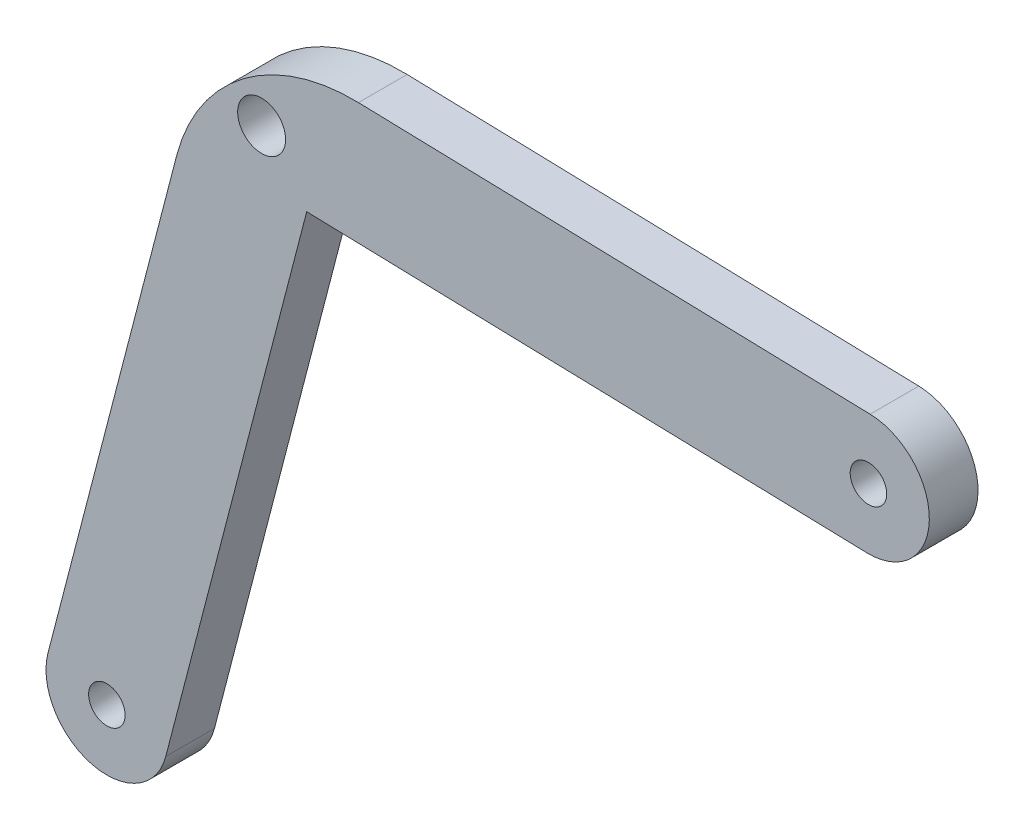
ISO-10303-21;
HEADER;
FILE_DESCRIPTION(('STEP AP214'),'2;1');
FILE_NAME('part.step','',(''),(''),'','','');
FILE_SCHEMA(('AUTOMOTIVE_DESIGN { 1 0 10303 214 1 1 1 1 }'));
ENDSEC;
DATA;
#1=APPLICATION_CONTEXT('core data for automotive mechanical design processes');
#2=APPLICATION_PROTOCOL_DEFINITION('international standard','automotive_design',2000,#1);
#3=PRODUCT_CONTEXT('',#1,'mechanical');
#4=PRODUCT('Part','Part','',(#3));
#5=PRODUCT_RELATED_PRODUCT_CATEGORY('part','',(#4));
#6=PRODUCT_DEFINITION_FORMATION('','',#4);
#7=PRODUCT_DEFINITION_CONTEXT('part definition',#1,'design');
#8=PRODUCT_DEFINITION('design','',#6,#7);
#9=PRODUCT_DEFINITION_SHAPE('','',#8);
#10=(LENGTH_UNIT() NAMED_UNIT(*) SI_UNIT(.MILLI.,.METRE.));
#11=(NAMED_UNIT(*) PLANE_ANGLE_UNIT() SI_UNIT($,.RADIAN.));
#12=(NAMED_UNIT(*) SI_UNIT($,.STERADIAN.) SOLID_ANGLE_UNIT());
#13=UNCERTAINTY_MEASURE_WITH_UNIT(LENGTH_MEASURE(1.E-05),#10,'distance_accuracy_value','');
#14=(GEOMETRIC_REPRESENTATION_CONTEXT(3) GLOBAL_UNCERTAINTY_ASSIGNED_CONTEXT((#13)) GLOBAL_UNIT_ASSIGNED_CONTEXT((#10,
#11,#12)) REPRESENTATION_CONTEXT('',''));
#15=CARTESIAN_POINT('',(0.,0.,0.));
#16=DIRECTION('',(0.,0.,1.));
#17=DIRECTION('',(1.,0.,0.));
#18=AXIS2_PLACEMENT_3D('',#15,#16,#17);
#19=CARTESIAN_POINT('',(55.3800124205492,12.4797142030758,4.));
#20=DIRECTION('',(0.,0.,1.));
#21=DIRECTION('',(1.,0.,0.));
#22=AXIS2_PLACEMENT_3D('',#19,#20,#21);
#23=PLANE('',#22);
#24=CARTESIAN_POINT('',(-7.17896809996962,-34.5429317024096,4.));
#25=DIRECTION('',(0.,0.,1.));
#26=DIRECTION('',(1.,0.,0.));
#27=AXIS2_PLACEMENT_3D('',#24,#25,#26);
#28=CIRCLE('',#27,1.5);
#29=CARTESIAN_POINT('',(-5.67896809996962,-34.5429317024096,4.));
#30=VERTEX_POINT('',#29);
#31=EDGE_CURVE('E155',#30,#30,#28,.T.);
#32=ORIENTED_EDGE('',*,*,#31,.F.);
#33=EDGE_LOOP('',(#32));
#34=FACE_BOUND('',#33,.T.);
#35=DIRECTION('',(-0.999624819704954,0.0273901411065842,0.));
#36=VECTOR('',#35,1.);
#37=CARTESIAN_POINT('',(55.5169631260821,17.4778383016006,4.));
#38=LINE('',#37,#36);
#39=CARTESIAN_POINT('',(55.5169631260821,17.4778383016006,4.));
#40=VERTEX_POINT('',#39);
#41=CARTESIAN_POINT('',(13.4870969886936,18.6294743369421,4.));
#42=VERTEX_POINT('',#41);
#43=EDGE_CURVE('E95',#40,#42,#38,.T.);
#44=ORIENTED_EDGE('',*,*,#43,.T.);
#45=CARTESIAN_POINT('',(13.0762448720949,3.63510204136775,4.));
#46=DIRECTION('',(0.,0.,1.));
#47=DIRECTION('',(1.,0.,0.));
#48=AXIS2_PLACEMENT_3D('',#45,#46,#47);
#49=CIRCLE('',#48,15.);
#50=CARTESIAN_POINT('',(-1.44140101614952,7.40842390194908,4.));
#51=VERTEX_POINT('',#50);
#52=EDGE_CURVE('E11',#42,#51,#49,.T.);
#53=ORIENTED_EDGE('',*,*,#52,.T.);
#54=DIRECTION('',(-0.251554790705422,-0.967843059216292,0.));
#55=VECTOR('',#54,1.);
#56=CARTESIAN_POINT('',(1.56003471690475,18.9562808669237,4.));
#57=LINE('',#56,#55);
#58=CARTESIAN_POINT('',(-12.0181833960511,-33.2851577488824,4.));
#59=VERTEX_POINT('',#58);
#60=EDGE_CURVE('E103',#51,#59,#57,.T.);
#61=ORIENTED_EDGE('',*,*,#60,.T.);
#62=CARTESIAN_POINT('',(-7.17896809996962,-34.5429317024096,4.));
#63=DIRECTION('',(0.,0.,1.));
#64=DIRECTION('',(-1.,0.,0.));
#65=AXIS2_PLACEMENT_3D('',#62,#63,#64);
#66=CIRCLE('',#65,5.);
#67=CARTESIAN_POINT('',(-2.33975280388816,-35.8007056559367,4.));
#68=VERTEX_POINT('',#67);
#69=EDGE_CURVE('E149',#59,#68,#66,.T.);
#70=ORIENTED_EDGE('',*,*,#69,.T.);
#71=DIRECTION('',(0.251554790705422,0.967843059216292,0.));
#72=VECTOR('',#71,1.);
#73=CARTESIAN_POINT('',(9.23750815369816,8.7421616498864,4.));
#74=LINE('',#73,#72);
#75=CARTESIAN_POINT('',(9.23750815369816,8.7421616498864,4.));
#76=VERTEX_POINT('',#75);
#77=EDGE_CURVE('E147',#68,#76,#74,.T.);
#78=ORIENTED_EDGE('',*,*,#77,.T.);
#79=DIRECTION('',(0.999624819704954,-0.0273901411065842,0.));
#80=VECTOR('',#79,1.);
#81=CARTESIAN_POINT('',(55.2430617150162,7.48159010455108,4.));
#82=LINE('',#81,#80);
#83=CARTESIAN_POINT('',(55.2430617150162,7.48159010455108,4.));
#84=VERTEX_POINT('',#83);
#85=EDGE_CURVE('E109',#76,#84,#82,.T.);
#86=ORIENTED_EDGE('',*,*,#85,.T.);
#87=CARTESIAN_POINT('',(55.3800124205492,12.4797142030758,4.));
#88=DIRECTION('',(0.,0.,1.));
#89=DIRECTION('',(1.,0.,0.));
#90=AXIS2_PLACEMENT_3D('',#87,#88,#89);
#91=CIRCLE('',#90,5.);
#92=EDGE_CURVE('E104',#84,#40,#91,.T.);
#93=ORIENTED_EDGE('',*,*,#92,.T.);
#94=EDGE_LOOP('',(#44,#53,#61,#70,#78,#86,#93));
#95=FACE_BOUND('',#94,.T.);
#96=CARTESIAN_POINT('',(5.53497273827364,13.0037237611577,4.));
#97=DIRECTION('',(0.,0.,1.));
#98=DIRECTION('',(1.,0.,0.));
#99=AXIS2_PLACEMENT_3D('',#96,#97,#98);
#100=CIRCLE('',#99,1.9704358974962);
#101=CARTESIAN_POINT('',(7.50540863576983,13.0037237611577,4.));
#102=VERTEX_POINT('',#101);
#103=EDGE_CURVE('E145',#102,#102,#100,.T.);
#104=ORIENTED_EDGE('',*,*,#103,.F.);
#105=EDGE_LOOP('',(#104));
#106=FACE_BOUND('',#105,.T.);
#107=CARTESIAN_POINT('',(55.3800124205492,12.4797142030758,4.));
#108=DIRECTION('',(0.,0.,1.));
#109=DIRECTION('',(1.,0.,0.));
#110=AXIS2_PLACEMENT_3D('',#107,#108,#109);
#111=CIRCLE('',#110,1.5);
#112=CARTESIAN_POINT('',(56.8800124205492,12.4797142030758,4.));
#113=VERTEX_POINT('',#112);
#114=EDGE_CURVE('E161',#113,#113,#111,.T.);
#115=ORIENTED_EDGE('',*,*,#114,.F.);
#116=EDGE_LOOP('',(#115));
#117=FACE_BOUND('',#116,.T.);
#118=ADVANCED_FACE('F40',(#34,#95,#106,#117),#23,.T.);
#119=CARTESIAN_POINT('',(55.3800124205492,12.4797142030758,0.));
#120=DIRECTION('',(0.,0.,1.));
#121=DIRECTION('',(1.,0.,0.));
#122=AXIS2_PLACEMENT_3D('',#119,#120,#121);
#123=PLANE('',#122);
#124=DIRECTION('',(-0.251554790705422,-0.967843059216292,0.));
#125=VECTOR('',#124,1.);
#126=CARTESIAN_POINT('',(1.56003471690475,18.9562808669237,0.));
#127=LINE('',#126,#125);
#128=CARTESIAN_POINT('',(-1.44140101614952,7.40842390194908,0.));
#129=VERTEX_POINT('',#128);
#130=CARTESIAN_POINT('',(-12.0181833960511,-33.2851577488824,0.));
#131=VERTEX_POINT('',#130);
#132=EDGE_CURVE('E140',#129,#131,#127,.T.);
#133=ORIENTED_EDGE('',*,*,#132,.F.);
#134=CARTESIAN_POINT('',(13.0762448720949,3.63510204136775,0.));
#135=DIRECTION('',(0.,0.,1.));
#136=DIRECTION('',(1.,0.,0.));
#137=AXIS2_PLACEMENT_3D('',#134,#135,#136);
#138=CIRCLE('',#137,15.);
#139=CARTESIAN_POINT('',(13.4870969886936,18.6294743369421,0.));
#140=VERTEX_POINT('',#139);
#141=EDGE_CURVE('E62',#129,#140,#138,.F.);
#142=ORIENTED_EDGE('',*,*,#141,.T.);
#143=DIRECTION('',(-0.999624819704954,0.0273901411065842,0.));
#144=VECTOR('',#143,1.);
#145=CARTESIAN_POINT('',(55.5169631260821,17.4778383016006,0.));
#146=LINE('',#145,#144);
#147=CARTESIAN_POINT('',(55.5169631260821,17.4778383016006,0.));
#148=VERTEX_POINT('',#147);
#149=EDGE_CURVE('E142',#148,#140,#146,.T.);
#150=ORIENTED_EDGE('',*,*,#149,.F.);
#151=CARTESIAN_POINT('',(55.3800124205492,12.4797142030758,0.));
#152=DIRECTION('',(0.,0.,1.));
#153=DIRECTION('',(1.,0.,0.));
#154=AXIS2_PLACEMENT_3D('',#151,#152,#153);
#155=CIRCLE('',#154,5.);
#156=CARTESIAN_POINT('',(55.2430617150162,7.48159010455108,0.));
#157=VERTEX_POINT('',#156);
#158=EDGE_CURVE('E117',#157,#148,#155,.T.);
#159=ORIENTED_EDGE('',*,*,#158,.F.);
#160=DIRECTION('',(0.999624819704954,-0.0273901411065842,0.));
#161=VECTOR('',#160,1.);
#162=CARTESIAN_POINT('',(55.2430617150162,7.48159010455108,0.));
#163=LINE('',#162,#161);
#164=CARTESIAN_POINT('',(9.23750815369816,8.7421616498864,0.));
#165=VERTEX_POINT('',#164);
#166=EDGE_CURVE('E113',#165,#157,#163,.T.);
#167=ORIENTED_EDGE('',*,*,#166,.F.);
#168=DIRECTION('',(0.251554790705422,0.967843059216292,0.));
#169=VECTOR('',#168,1.);
#170=CARTESIAN_POINT('',(9.23750815369816,8.7421616498864,0.));
#171=LINE('',#170,#169);
#172=CARTESIAN_POINT('',(-2.33975280388816,-35.8007056559367,0.));
#173=VERTEX_POINT('',#172);
#174=EDGE_CURVE('E136',#173,#165,#171,.T.);
#175=ORIENTED_EDGE('',*,*,#174,.F.);
#176=CARTESIAN_POINT('',(-7.17896809996962,-34.5429317024096,0.));
#177=DIRECTION('',(0.,0.,1.));
#178=DIRECTION('',(-1.,0.,0.));
#179=AXIS2_PLACEMENT_3D('',#176,#177,#178);
#180=CIRCLE('',#179,5.);
#181=EDGE_CURVE('E138',#131,#173,#180,.T.);
#182=ORIENTED_EDGE('',*,*,#181,.F.);
#183=EDGE_LOOP('',(#133,#142,#150,#159,#167,#175,#182));
#184=FACE_BOUND('',#183,.T.);
#185=CARTESIAN_POINT('',(5.53497273827364,13.0037237611577,0.));
#186=DIRECTION('',(0.,0.,1.));
#187=DIRECTION('',(1.,0.,0.));
#188=AXIS2_PLACEMENT_3D('',#185,#186,#187);
#189=CIRCLE('',#188,1.9704358974962);
#190=CARTESIAN_POINT('',(7.50540863576983,13.0037237611577,0.));
#191=VERTEX_POINT('',#190);
#192=EDGE_CURVE('E152',#191,#191,#189,.T.);
#193=ORIENTED_EDGE('',*,*,#192,.T.);
#194=EDGE_LOOP('',(#193));
#195=FACE_BOUND('',#194,.T.);
#196=CARTESIAN_POINT('',(-7.17896809996962,-34.5429317024096,0.));
#197=DIRECTION('',(0.,0.,1.));
#198=DIRECTION('',(1.,0.,0.));
#199=AXIS2_PLACEMENT_3D('',#196,#197,#198);
#200=CIRCLE('',#199,1.5);
#201=CARTESIAN_POINT('',(-5.67896809996962,-34.5429317024096,0.));
#202=VERTEX_POINT('',#201);
#203=EDGE_CURVE('E158',#202,#202,#200,.T.);
#204=ORIENTED_EDGE('',*,*,#203,.T.);
#205=EDGE_LOOP('',(#204));
#206=FACE_BOUND('',#205,.T.);
#207=CARTESIAN_POINT('',(55.3800124205492,12.4797142030758,0.));
#208=DIRECTION('',(0.,0.,1.));
#209=DIRECTION('',(1.,0.,0.));
#210=AXIS2_PLACEMENT_3D('',#207,#208,#209);
#211=CIRCLE('',#210,1.5);
#212=CARTESIAN_POINT('',(56.8800124205492,12.4797142030758,0.));
#213=VERTEX_POINT('',#212);
#214=EDGE_CURVE('E164',#213,#213,#211,.T.);
#215=ORIENTED_EDGE('',*,*,#214,.T.);
#216=EDGE_LOOP('',(#215));
#217=FACE_BOUND('',#216,.T.);
#218=ADVANCED_FACE('F174',(#184,#195,#206,#217),#123,.F.);
#219=CARTESIAN_POINT('',(55.3800124205492,12.4797142030758,4.));
#220=DIRECTION('',(0.,0.,-1.));
#221=DIRECTION('',(-1.,0.,0.));
#222=AXIS2_PLACEMENT_3D('',#219,#220,#221);
#223=CYLINDRICAL_SURFACE('',#222,5.);
#224=ORIENTED_EDGE('',*,*,#158,.T.);
#225=DIRECTION('',(0.,0.,-1.));
#226=VECTOR('',#225,1.);
#227=CARTESIAN_POINT('',(55.5169631260821,17.4778383016006,4.));
#228=LINE('',#227,#226);
#229=EDGE_CURVE('E99',#40,#148,#228,.T.);
#230=ORIENTED_EDGE('',*,*,#229,.F.);
#231=ORIENTED_EDGE('',*,*,#92,.F.);
#232=DIRECTION('',(0.,0.,-1.));
#233=VECTOR('',#232,1.);
#234=CARTESIAN_POINT('',(55.2430617150162,7.48159010455108,4.));
#235=LINE('',#234,#233);
#236=EDGE_CURVE('E133',#84,#157,#235,.T.);
#237=ORIENTED_EDGE('',*,*,#236,.T.);
#238=EDGE_LOOP('',(#224,#230,#231,#237));
#239=FACE_BOUND('',#238,.T.);
#240=ADVANCED_FACE('F115',(#239),#223,.T.);
#241=CARTESIAN_POINT('',(55.5169631260821,17.4778383016006,4.));
#242=DIRECTION('',(-0.0273901411065842,-0.999624819704954,0.));
#243=DIRECTION('',(0.999624819704954,-0.0273901411065842,0.));
#244=AXIS2_PLACEMENT_3D('',#241,#242,#243);
#245=PLANE('',#244);
#246=ORIENTED_EDGE('',*,*,#149,.T.);
#247=DIRECTION('',(0.,0.,-1.));
#248=VECTOR('',#247,1.);
#249=CARTESIAN_POINT('',(13.4870969886936,18.6294743369421,4.));
#250=LINE('',#249,#248);
#251=EDGE_CURVE('E48',#140,#42,#250,.F.);
#252=ORIENTED_EDGE('',*,*,#251,.T.);
#253=ORIENTED_EDGE('',*,*,#43,.F.);
#254=ORIENTED_EDGE('',*,*,#229,.T.);
#255=EDGE_LOOP('',(#246,#252,#253,#254));
#256=FACE_BOUND('',#255,.T.);
#257=ADVANCED_FACE('F97',(#256),#245,.F.);
#258=CARTESIAN_POINT('',(1.56003471690475,18.9562808669237,4.));
#259=DIRECTION('',(0.967843059216292,-0.251554790705422,0.));
#260=DIRECTION('',(0.251554790705422,0.967843059216292,0.));
#261=AXIS2_PLACEMENT_3D('',#258,#259,#260);
#262=PLANE('',#261);
#263=ORIENTED_EDGE('',*,*,#60,.F.);
#264=DIRECTION('',(0.,0.,-1.));
#265=VECTOR('',#264,1.);
#266=CARTESIAN_POINT('',(-1.44140101614952,7.40842390194907,4.));
#267=LINE('',#266,#265);
#268=EDGE_CURVE('E118',#51,#129,#267,.T.);
#269=ORIENTED_EDGE('',*,*,#268,.T.);
#270=ORIENTED_EDGE('',*,*,#132,.T.);
#271=DIRECTION('',(0.,0.,-1.));
#272=VECTOR('',#271,1.);
#273=CARTESIAN_POINT('',(-12.0181833960511,-33.2851577488824,4.));
#274=LINE('',#273,#272);
#275=EDGE_CURVE('E119',#59,#131,#274,.T.);
#276=ORIENTED_EDGE('',*,*,#275,.F.);
#277=EDGE_LOOP('',(#263,#269,#270,#276));
#278=FACE_BOUND('',#277,.T.);
#279=ADVANCED_FACE('F198',(#278),#262,.F.);
#280=CARTESIAN_POINT('',(-7.17896809996962,-34.5429317024096,4.));
#281=DIRECTION('',(0.,0.,-1.));
#282=DIRECTION('',(-1.,0.,0.));
#283=AXIS2_PLACEMENT_3D('',#280,#281,#282);
#284=CYLINDRICAL_SURFACE('',#283,5.);
#285=ORIENTED_EDGE('',*,*,#181,.T.);
#286=DIRECTION('',(0.,0.,-1.));
#287=VECTOR('',#286,1.);
#288=CARTESIAN_POINT('',(-2.33975280388816,-35.8007056559367,4.));
#289=LINE('',#288,#287);
#290=EDGE_CURVE('E124',#68,#173,#289,.T.);
#291=ORIENTED_EDGE('',*,*,#290,.F.);
#292=ORIENTED_EDGE('',*,*,#69,.F.);
#293=ORIENTED_EDGE('',*,*,#275,.T.);
#294=EDGE_LOOP('',(#285,#291,#292,#293));
#295=FACE_BOUND('',#294,.T.);
#296=ADVANCED_FACE('F194',(#295),#284,.T.);
#297=CARTESIAN_POINT('',(9.23750815369816,8.7421616498864,4.));
#298=DIRECTION('',(-0.967843059216292,0.251554790705422,0.));
#299=DIRECTION('',(-0.251554790705422,-0.967843059216292,0.));
#300=AXIS2_PLACEMENT_3D('',#297,#298,#299);
#301=PLANE('',#300);
#302=ORIENTED_EDGE('',*,*,#174,.T.);
#303=DIRECTION('',(0.,0.,-1.));
#304=VECTOR('',#303,1.);
#305=CARTESIAN_POINT('',(9.23750815369816,8.7421616498864,4.));
#306=LINE('',#305,#304);
#307=EDGE_CURVE('E130',#76,#165,#306,.T.);
#308=ORIENTED_EDGE('',*,*,#307,.F.);
#309=ORIENTED_EDGE('',*,*,#77,.F.);
#310=ORIENTED_EDGE('',*,*,#290,.T.);
#311=EDGE_LOOP('',(#302,#308,#309,#310));
#312=FACE_BOUND('',#311,.T.);
#313=ADVANCED_FACE('F190',(#312),#301,.F.);
#314=CARTESIAN_POINT('',(55.2430617150162,7.48159010455108,4.));
#315=DIRECTION('',(0.0273901411065843,0.999624819704954,0.));
#316=DIRECTION('',(-0.999624819704954,0.0273901411065843,0.));
#317=AXIS2_PLACEMENT_3D('',#314,#315,#316);
#318=PLANE('',#317);
#319=ORIENTED_EDGE('',*,*,#166,.T.);
#320=ORIENTED_EDGE('',*,*,#236,.F.);
#321=ORIENTED_EDGE('',*,*,#85,.F.);
#322=ORIENTED_EDGE('',*,*,#307,.T.);
#323=EDGE_LOOP('',(#319,#320,#321,#322));
#324=FACE_BOUND('',#323,.T.);
#325=ADVANCED_FACE('F187',(#324),#318,.F.);
#326=CARTESIAN_POINT('',(5.53497273827364,13.0037237611577,4.));
#327=DIRECTION('',(0.,0.,-1.));
#328=DIRECTION('',(-1.,0.,0.));
#329=AXIS2_PLACEMENT_3D('',#326,#327,#328);
#330=CYLINDRICAL_SURFACE('',#329,1.9704358974962);
#331=ORIENTED_EDGE('',*,*,#103,.T.);
#332=EDGE_LOOP('',(#331));
#333=FACE_BOUND('',#332,.T.);
#334=ORIENTED_EDGE('',*,*,#192,.F.);
#335=EDGE_LOOP('',(#334));
#336=FACE_BOUND('',#335,.T.);
#337=ADVANCED_FACE('F184',(#333,#336),#330,.F.);
#338=CARTESIAN_POINT('',(-7.17896809996962,-34.5429317024096,4.));
#339=DIRECTION('',(0.,0.,-1.));
#340=DIRECTION('',(-1.,0.,0.));
#341=AXIS2_PLACEMENT_3D('',#338,#339,#340);
#342=CYLINDRICAL_SURFACE('',#341,1.5);
#343=ORIENTED_EDGE('',*,*,#31,.T.);
#344=EDGE_LOOP('',(#343));
#345=FACE_BOUND('',#344,.T.);
#346=ORIENTED_EDGE('',*,*,#203,.F.);
#347=EDGE_LOOP('',(#346));
#348=FACE_BOUND('',#347,.T.);
#349=ADVANCED_FACE('F245',(#345,#348),#342,.F.);
#350=CARTESIAN_POINT('',(55.3800124205492,12.4797142030758,4.));
#351=DIRECTION('',(0.,0.,-1.));
#352=DIRECTION('',(-1.,0.,0.));
#353=AXIS2_PLACEMENT_3D('',#350,#351,#352);
#354=CYLINDRICAL_SURFACE('',#353,1.5);
#355=ORIENTED_EDGE('',*,*,#114,.T.);
#356=EDGE_LOOP('',(#355));
#357=FACE_BOUND('',#356,.T.);
#358=ORIENTED_EDGE('',*,*,#214,.F.);
#359=EDGE_LOOP('',(#358));
#360=FACE_BOUND('',#359,.T.);
#361=ADVANCED_FACE('F170',(#357,#360),#354,.F.);
#362=CARTESIAN_POINT('',(13.0762448720949,3.63510204136775,4.));
#363=DIRECTION('',(0.,0.,-1.));
#364=DIRECTION('',(-1.,0.,0.));
#365=AXIS2_PLACEMENT_3D('',#362,#363,#364);
#366=CYLINDRICAL_SURFACE('',#365,15.);
#367=ORIENTED_EDGE('',*,*,#52,.F.);
#368=ORIENTED_EDGE('',*,*,#251,.F.);
#369=ORIENTED_EDGE('',*,*,#141,.F.);
#370=ORIENTED_EDGE('',*,*,#268,.F.);
#371=EDGE_LOOP('',(#367,#368,#369,#370));
#372=FACE_BOUND('',#371,.T.);
#373=ADVANCED_FACE('F42',(#372),#366,.T.);
#374=CLOSED_SHELL('',(#118,#218,#240,#257,#279,#296,#313,#325,#337,#349,#361,#373));
#375=MANIFOLD_SOLID_BREP('B2',#374);
#376=ADVANCED_BREP_SHAPE_REPRESENTATION('',(#18,#375),#14);
#377=SHAPE_DEFINITION_REPRESENTATION(#9,#376);
ENDSEC;
END-ISO-10303-21;
